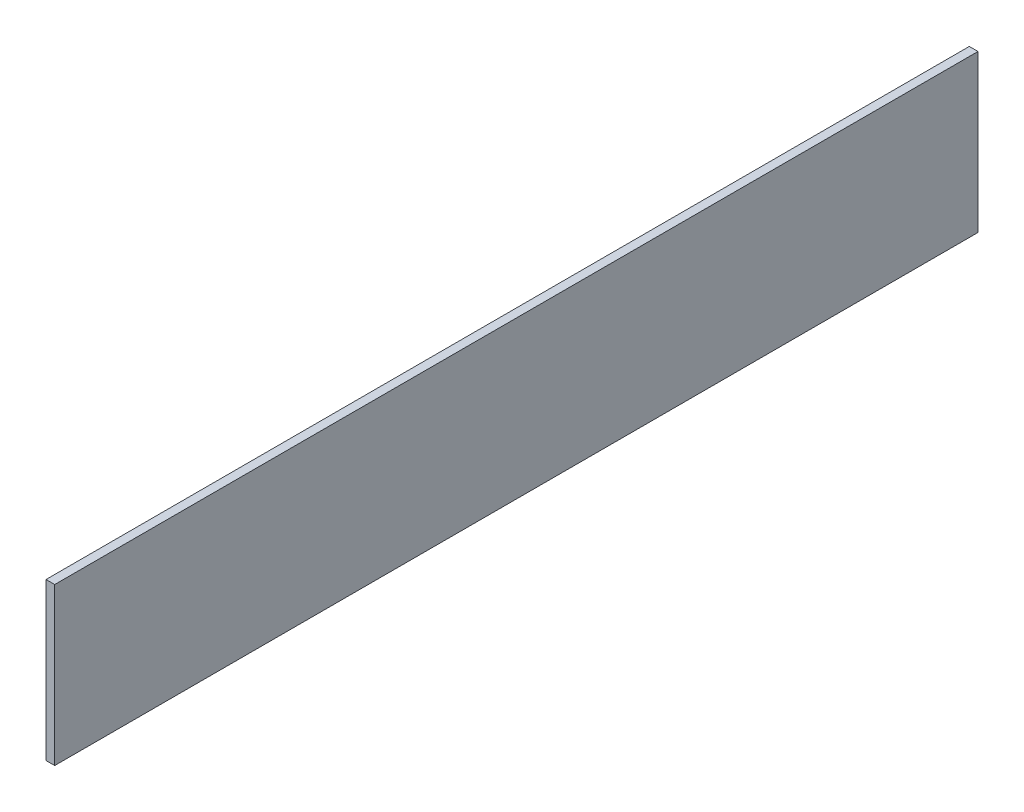
ISO-10303-21;
HEADER;
FILE_DESCRIPTION(('STEP AP214'),'2;1');
FILE_NAME('part.step','',(''),(''),'','','');
FILE_SCHEMA(('AUTOMOTIVE_DESIGN { 1 0 10303 214 1 1 1 1 }'));
ENDSEC;
DATA;
#1=APPLICATION_CONTEXT('core data for automotive mechanical design processes');
#2=APPLICATION_PROTOCOL_DEFINITION('international standard','automotive_design',2000,#1);
#3=PRODUCT_CONTEXT('',#1,'mechanical');
#4=PRODUCT('Part','Part','',(#3));
#5=PRODUCT_RELATED_PRODUCT_CATEGORY('part','',(#4));
#6=PRODUCT_DEFINITION_FORMATION('','',#4);
#7=PRODUCT_DEFINITION_CONTEXT('part definition',#1,'design');
#8=PRODUCT_DEFINITION('design','',#6,#7);
#9=PRODUCT_DEFINITION_SHAPE('','',#8);
#10=(LENGTH_UNIT() NAMED_UNIT(*) SI_UNIT(.MILLI.,.METRE.));
#11=(NAMED_UNIT(*) PLANE_ANGLE_UNIT() SI_UNIT($,.RADIAN.));
#12=(NAMED_UNIT(*) SI_UNIT($,.STERADIAN.) SOLID_ANGLE_UNIT());
#13=UNCERTAINTY_MEASURE_WITH_UNIT(LENGTH_MEASURE(1.E-05),#10,'distance_accuracy_value','');
#14=(GEOMETRIC_REPRESENTATION_CONTEXT(3) GLOBAL_UNCERTAINTY_ASSIGNED_CONTEXT((#13)) GLOBAL_UNIT_ASSIGNED_CONTEXT((#10,
#11,#12)) REPRESENTATION_CONTEXT('',''));
#15=CARTESIAN_POINT('',(0.,0.,0.));
#16=DIRECTION('',(0.,0.,1.));
#17=DIRECTION('',(1.,0.,0.));
#18=AXIS2_PLACEMENT_3D('',#15,#16,#17);
#19=CARTESIAN_POINT('',(1.5875,14.2875,84.1375));
#20=DIRECTION('',(0.,0.,-1.));
#21=DIRECTION('',(-1.,0.,0.));
#22=AXIS2_PLACEMENT_3D('',#19,#20,#21);
#23=PLANE('',#22);
#24=DIRECTION('',(0.,-1.,0.));
#25=VECTOR('',#24,1.);
#26=CARTESIAN_POINT('',(0.,14.2875,84.1375));
#27=LINE('',#26,#25);
#28=CARTESIAN_POINT('',(0.,14.2875,84.1375));
#29=VERTEX_POINT('',#28);
#30=CARTESIAN_POINT('',(0.,-14.2875,84.1375));
#31=VERTEX_POINT('',#30);
#32=EDGE_CURVE('E111',#29,#31,#27,.T.);
#33=ORIENTED_EDGE('',*,*,#32,.T.);
#34=DIRECTION('',(-1.,0.,0.));
#35=VECTOR('',#34,1.);
#36=CARTESIAN_POINT('',(1.5875,-14.2875,84.1375));
#37=LINE('',#36,#35);
#38=CARTESIAN_POINT('',(1.5875,-14.2875,84.1375));
#39=VERTEX_POINT('',#38);
#40=EDGE_CURVE('E11',#39,#31,#37,.T.);
#41=ORIENTED_EDGE('',*,*,#40,.F.);
#42=DIRECTION('',(0.,-1.,0.));
#43=VECTOR('',#42,1.);
#44=CARTESIAN_POINT('',(1.5875,14.2875,84.1375));
#45=LINE('',#44,#43);
#46=CARTESIAN_POINT('',(1.5875,14.2875,84.1375));
#47=VERTEX_POINT('',#46);
#48=EDGE_CURVE('E95',#47,#39,#45,.T.);
#49=ORIENTED_EDGE('',*,*,#48,.F.);
#50=DIRECTION('',(-1.,0.,0.));
#51=VECTOR('',#50,1.);
#52=CARTESIAN_POINT('',(1.5875,14.2875,84.1375));
#53=LINE('',#52,#51);
#54=EDGE_CURVE('E107',#47,#29,#53,.T.);
#55=ORIENTED_EDGE('',*,*,#54,.T.);
#56=EDGE_LOOP('',(#33,#41,#49,#55));
#57=FACE_BOUND('',#56,.T.);
#58=ADVANCED_FACE('F43',(#57),#23,.F.);
#59=CARTESIAN_POINT('',(1.5875,-14.2875,-84.1375));
#60=DIRECTION('',(0.,1.,0.));
#61=DIRECTION('',(0.,0.,1.));
#62=AXIS2_PLACEMENT_3D('',#59,#60,#61);
#63=PLANE('',#62);
#64=DIRECTION('',(0.,0.,-1.));
#65=VECTOR('',#64,1.);
#66=CARTESIAN_POINT('',(0.,-14.2875,-84.1375));
#67=LINE('',#66,#65);
#68=CARTESIAN_POINT('',(0.,-14.2875,-84.1375));
#69=VERTEX_POINT('',#68);
#70=EDGE_CURVE('E100',#31,#69,#67,.T.);
#71=ORIENTED_EDGE('',*,*,#70,.T.);
#72=DIRECTION('',(-1.,0.,0.));
#73=VECTOR('',#72,1.);
#74=CARTESIAN_POINT('',(1.5875,-14.2875,-84.1375));
#75=LINE('',#74,#73);
#76=CARTESIAN_POINT('',(1.5875,-14.2875,-84.1375));
#77=VERTEX_POINT('',#76);
#78=EDGE_CURVE('E52',#77,#69,#75,.T.);
#79=ORIENTED_EDGE('',*,*,#78,.F.);
#80=DIRECTION('',(0.,0.,-1.));
#81=VECTOR('',#80,1.);
#82=CARTESIAN_POINT('',(1.5875,-14.2875,-84.1375));
#83=LINE('',#82,#81);
#84=EDGE_CURVE('E90',#39,#77,#83,.T.);
#85=ORIENTED_EDGE('',*,*,#84,.F.);
#86=ORIENTED_EDGE('',*,*,#40,.T.);
#87=EDGE_LOOP('',(#71,#79,#85,#86));
#88=FACE_BOUND('',#87,.T.);
#89=ADVANCED_FACE('F99',(#88),#63,.F.);
#90=CARTESIAN_POINT('',(1.5875,14.2875,-84.1375));
#91=DIRECTION('',(0.,0.,1.));
#92=DIRECTION('',(1.,0.,0.));
#93=AXIS2_PLACEMENT_3D('',#90,#91,#92);
#94=PLANE('',#93);
#95=DIRECTION('',(0.,1.,0.));
#96=VECTOR('',#95,1.);
#97=CARTESIAN_POINT('',(0.,14.2875,-84.1375));
#98=LINE('',#97,#96);
#99=CARTESIAN_POINT('',(0.,14.2875,-84.1375));
#100=VERTEX_POINT('',#99);
#101=EDGE_CURVE('E77',#69,#100,#98,.T.);
#102=ORIENTED_EDGE('',*,*,#101,.T.);
#103=DIRECTION('',(-1.,0.,0.));
#104=VECTOR('',#103,1.);
#105=CARTESIAN_POINT('',(1.5875,14.2875,-84.1375));
#106=LINE('',#105,#104);
#107=CARTESIAN_POINT('',(1.5875,14.2875,-84.1375));
#108=VERTEX_POINT('',#107);
#109=EDGE_CURVE('E102',#108,#100,#106,.T.);
#110=ORIENTED_EDGE('',*,*,#109,.F.);
#111=DIRECTION('',(0.,1.,0.));
#112=VECTOR('',#111,1.);
#113=CARTESIAN_POINT('',(1.5875,14.2875,-84.1375));
#114=LINE('',#113,#112);
#115=EDGE_CURVE('E93',#77,#108,#114,.T.);
#116=ORIENTED_EDGE('',*,*,#115,.F.);
#117=ORIENTED_EDGE('',*,*,#78,.T.);
#118=EDGE_LOOP('',(#102,#110,#116,#117));
#119=FACE_BOUND('',#118,.T.);
#120=ADVANCED_FACE('F103',(#119),#94,.F.);
#121=CARTESIAN_POINT('',(1.5875,14.2875,-84.1375));
#122=DIRECTION('',(0.,-1.,0.));
#123=DIRECTION('',(0.,0.,-1.));
#124=AXIS2_PLACEMENT_3D('',#121,#122,#123);
#125=PLANE('',#124);
#126=DIRECTION('',(0.,0.,1.));
#127=VECTOR('',#126,1.);
#128=CARTESIAN_POINT('',(0.,14.2875,-84.1375));
#129=LINE('',#128,#127);
#130=EDGE_CURVE('E83',#100,#29,#129,.T.);
#131=ORIENTED_EDGE('',*,*,#130,.T.);
#132=ORIENTED_EDGE('',*,*,#54,.F.);
#133=DIRECTION('',(0.,0.,1.));
#134=VECTOR('',#133,1.);
#135=CARTESIAN_POINT('',(1.5875,14.2875,-84.1375));
#136=LINE('',#135,#134);
#137=EDGE_CURVE('E60',#108,#47,#136,.T.);
#138=ORIENTED_EDGE('',*,*,#137,.F.);
#139=ORIENTED_EDGE('',*,*,#109,.T.);
#140=EDGE_LOOP('',(#131,#132,#138,#139));
#141=FACE_BOUND('',#140,.T.);
#142=ADVANCED_FACE('F124',(#141),#125,.F.);
#143=CARTESIAN_POINT('',(1.5875,0.,0.));
#144=DIRECTION('',(-1.,0.,0.));
#145=DIRECTION('',(0.,0.,1.));
#146=AXIS2_PLACEMENT_3D('',#143,#144,#145);
#147=PLANE('',#146);
#148=ORIENTED_EDGE('',*,*,#48,.T.);
#149=ORIENTED_EDGE('',*,*,#84,.T.);
#150=ORIENTED_EDGE('',*,*,#115,.T.);
#151=ORIENTED_EDGE('',*,*,#137,.T.);
#152=EDGE_LOOP('',(#148,#149,#150,#151));
#153=FACE_BOUND('',#152,.T.);
#154=ADVANCED_FACE('F91',(#153),#147,.F.);
#155=CARTESIAN_POINT('',(0.,0.,0.));
#156=DIRECTION('',(-1.,0.,0.));
#157=DIRECTION('',(0.,0.,1.));
#158=AXIS2_PLACEMENT_3D('',#155,#156,#157);
#159=PLANE('',#158);
#160=ORIENTED_EDGE('',*,*,#32,.F.);
#161=ORIENTED_EDGE('',*,*,#130,.F.);
#162=ORIENTED_EDGE('',*,*,#101,.F.);
#163=ORIENTED_EDGE('',*,*,#70,.F.);
#164=EDGE_LOOP('',(#160,#161,#162,#163));
#165=FACE_BOUND('',#164,.T.);
#166=ADVANCED_FACE('F127',(#165),#159,.T.);
#167=CLOSED_SHELL('',(#58,#89,#120,#142,#154,#166));
#168=MANIFOLD_SOLID_BREP('B2',#167);
#169=ADVANCED_BREP_SHAPE_REPRESENTATION('',(#18,#168),#14);
#170=SHAPE_DEFINITION_REPRESENTATION(#9,#169);
ENDSEC;
END-ISO-10303-21;
